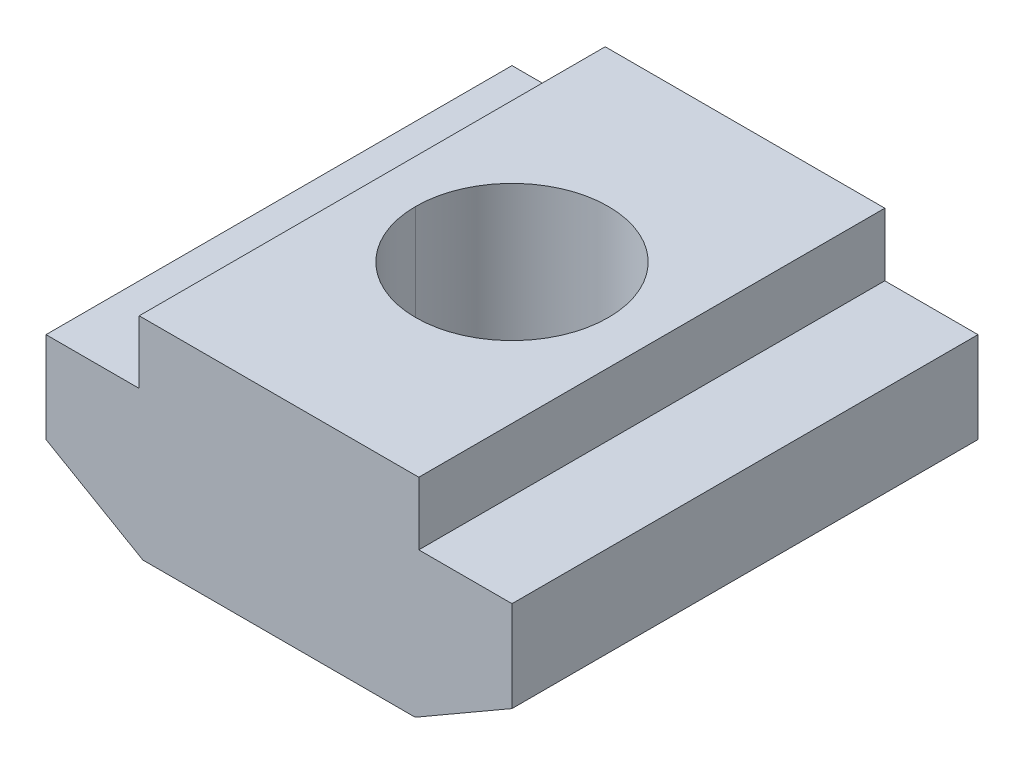
ISO-10303-21;
HEADER;
FILE_DESCRIPTION(('STEP AP214'),'2;1');
FILE_NAME('part.step','',(''),(''),'','','');
FILE_SCHEMA(('AUTOMOTIVE_DESIGN { 1 0 10303 214 1 1 1 1 }'));
ENDSEC;
DATA;
#1=APPLICATION_CONTEXT('core data for automotive mechanical design processes');
#2=APPLICATION_PROTOCOL_DEFINITION('international standard','automotive_design',2000,#1);
#3=PRODUCT_CONTEXT('',#1,'mechanical');
#4=PRODUCT('Part','Part','',(#3));
#5=PRODUCT_RELATED_PRODUCT_CATEGORY('part','',(#4));
#6=PRODUCT_DEFINITION_FORMATION('','',#4);
#7=PRODUCT_DEFINITION_CONTEXT('part definition',#1,'design');
#8=PRODUCT_DEFINITION('design','',#6,#7);
#9=PRODUCT_DEFINITION_SHAPE('','',#8);
#10=(LENGTH_UNIT() NAMED_UNIT(*) SI_UNIT(.MILLI.,.METRE.));
#11=(NAMED_UNIT(*) PLANE_ANGLE_UNIT() SI_UNIT($,.RADIAN.));
#12=(NAMED_UNIT(*) SI_UNIT($,.STERADIAN.) SOLID_ANGLE_UNIT());
#13=UNCERTAINTY_MEASURE_WITH_UNIT(LENGTH_MEASURE(1.E-05),#10,'distance_accuracy_value','');
#14=(GEOMETRIC_REPRESENTATION_CONTEXT(3) GLOBAL_UNCERTAINTY_ASSIGNED_CONTEXT((#13)) GLOBAL_UNIT_ASSIGNED_CONTEXT((#10,
#11,#12)) REPRESENTATION_CONTEXT('',''));
#15=CARTESIAN_POINT('',(0.,0.,0.));
#16=DIRECTION('',(0.,0.,1.));
#17=DIRECTION('',(1.,0.,0.));
#18=AXIS2_PLACEMENT_3D('',#15,#16,#17);
#19=CARTESIAN_POINT('',(-5.,-0.375,0.));
#20=DIRECTION('',(0.50000000000019,0.866025403784329,0.));
#21=DIRECTION('',(0.,0.,-1.));
#22=AXIS2_PLACEMENT_3D('',#19,#20,#21);
#23=PLANE('',#22);
#24=DIRECTION('',(0.,0.,1.));
#25=VECTOR('',#24,1.);
#26=CARTESIAN_POINT('',(-5.,-0.375,0.));
#27=LINE('',#26,#25);
#28=CARTESIAN_POINT('',(-5.,-0.375,-5.));
#29=VERTEX_POINT('',#28);
#30=CARTESIAN_POINT('',(-5.,-0.375,5.));
#31=VERTEX_POINT('',#30);
#32=EDGE_CURVE('E191',#29,#31,#27,.T.);
#33=ORIENTED_EDGE('',*,*,#32,.F.);
#34=DIRECTION('',(0.866025403784329,-0.50000000000019,0.));
#35=VECTOR('',#34,1.);
#36=CARTESIAN_POINT('',(-3.96076951546,-0.975,-5.));
#37=LINE('',#36,#35);
#38=CARTESIAN_POINT('',(-2.92153903092,-1.575,-5.));
#39=VERTEX_POINT('',#38);
#40=EDGE_CURVE('E200',#29,#39,#37,.T.);
#41=ORIENTED_EDGE('',*,*,#40,.T.);
#42=DIRECTION('',(0.,0.,1.));
#43=VECTOR('',#42,1.);
#44=CARTESIAN_POINT('',(-2.92153903092,-1.575,0.));
#45=LINE('',#44,#43);
#46=CARTESIAN_POINT('',(-2.92153903092,-1.575,5.));
#47=VERTEX_POINT('',#46);
#48=EDGE_CURVE('E11',#39,#47,#45,.T.);
#49=ORIENTED_EDGE('',*,*,#48,.T.);
#50=DIRECTION('',(-0.866025403784329,0.50000000000019,0.));
#51=VECTOR('',#50,1.);
#52=CARTESIAN_POINT('',(-3.96076951546,-0.975,5.));
#53=LINE('',#52,#51);
#54=EDGE_CURVE('E26',#47,#31,#53,.T.);
#55=ORIENTED_EDGE('',*,*,#54,.T.);
#56=EDGE_LOOP('',(#33,#41,#49,#55));
#57=FACE_BOUND('',#56,.T.);
#58=ADVANCED_FACE('F17',(#57),#23,.F.);
#59=CARTESIAN_POINT('',(5.,-1.575,0.));
#60=DIRECTION('',(0.,1.,0.));
#61=DIRECTION('',(1.,0.,0.));
#62=AXIS2_PLACEMENT_3D('',#59,#60,#61);
#63=PLANE('',#62);
#64=CARTESIAN_POINT('',(0.,-1.575,0.));
#65=DIRECTION('',(0.,1.,0.));
#66=DIRECTION('',(1.,0.,0.));
#67=AXIS2_PLACEMENT_3D('',#64,#65,#66);
#68=CIRCLE('',#67,2.067);
#69=CARTESIAN_POINT('',(-2.067,-1.575,0.));
#70=VERTEX_POINT('',#69);
#71=CARTESIAN_POINT('',(2.067,-1.575,0.));
#72=VERTEX_POINT('',#71);
#73=EDGE_CURVE('E230',#70,#72,#68,.T.);
#74=ORIENTED_EDGE('',*,*,#73,.T.);
#75=CARTESIAN_POINT('',(0.,-1.575,0.));
#76=DIRECTION('',(0.,1.,0.));
#77=DIRECTION('',(1.,0.,0.));
#78=AXIS2_PLACEMENT_3D('',#75,#76,#77);
#79=CIRCLE('',#78,2.067);
#80=EDGE_CURVE('E242',#72,#70,#79,.T.);
#81=ORIENTED_EDGE('',*,*,#80,.T.);
#82=EDGE_LOOP('',(#74,#81));
#83=FACE_BOUND('',#82,.T.);
#84=ORIENTED_EDGE('',*,*,#48,.F.);
#85=DIRECTION('',(1.,0.,0.));
#86=VECTOR('',#85,1.);
#87=CARTESIAN_POINT('',(0.,-1.575,-5.));
#88=LINE('',#87,#86);
#89=CARTESIAN_POINT('',(2.92153903092,-1.575,-5.));
#90=VERTEX_POINT('',#89);
#91=EDGE_CURVE('E203',#39,#90,#88,.T.);
#92=ORIENTED_EDGE('',*,*,#91,.T.);
#93=DIRECTION('',(0.,0.,1.));
#94=VECTOR('',#93,1.);
#95=CARTESIAN_POINT('',(2.92153903092,-1.575,0.));
#96=LINE('',#95,#94);
#97=CARTESIAN_POINT('',(2.92153903092,-1.575,5.));
#98=VERTEX_POINT('',#97);
#99=EDGE_CURVE('E183',#90,#98,#96,.T.);
#100=ORIENTED_EDGE('',*,*,#99,.T.);
#101=DIRECTION('',(1.,0.,0.));
#102=VECTOR('',#101,1.);
#103=CARTESIAN_POINT('',(0.,-1.575,5.));
#104=LINE('',#103,#102);
#105=EDGE_CURVE('E206',#47,#98,#104,.T.);
#106=ORIENTED_EDGE('',*,*,#105,.F.);
#107=EDGE_LOOP('',(#84,#92,#100,#106));
#108=FACE_BOUND('',#107,.T.);
#109=ADVANCED_FACE('F19',(#83,#108),#63,.F.);
#110=CARTESIAN_POINT('',(0.,0.,5.));
#111=DIRECTION('',(0.,0.,1.));
#112=DIRECTION('',(1.,0.,0.));
#113=AXIS2_PLACEMENT_3D('',#110,#111,#112);
#114=PLANE('',#113);
#115=ORIENTED_EDGE('',*,*,#105,.T.);
#116=DIRECTION('',(-0.866025403784329,-0.50000000000019,0.));
#117=VECTOR('',#116,1.);
#118=CARTESIAN_POINT('',(3.96076951546,-0.975,5.));
#119=LINE('',#118,#117);
#120=CARTESIAN_POINT('',(5.,-0.375,5.));
#121=VERTEX_POINT('',#120);
#122=EDGE_CURVE('E190',#121,#98,#119,.T.);
#123=ORIENTED_EDGE('',*,*,#122,.F.);
#124=DIRECTION('',(0.,1.,0.));
#125=VECTOR('',#124,1.);
#126=CARTESIAN_POINT('',(5.,0.6,5.));
#127=LINE('',#126,#125);
#128=CARTESIAN_POINT('',(5.,1.575,5.));
#129=VERTEX_POINT('',#128);
#130=EDGE_CURVE('E180',#121,#129,#127,.T.);
#131=ORIENTED_EDGE('',*,*,#130,.T.);
#132=DIRECTION('',(-1.,0.,0.));
#133=VECTOR('',#132,1.);
#134=CARTESIAN_POINT('',(4.,1.575,5.));
#135=LINE('',#134,#133);
#136=CARTESIAN_POINT('',(3.,1.575,5.));
#137=VERTEX_POINT('',#136);
#138=EDGE_CURVE('E266',#129,#137,#135,.T.);
#139=ORIENTED_EDGE('',*,*,#138,.T.);
#140=DIRECTION('',(0.,1.,0.));
#141=VECTOR('',#140,1.);
#142=CARTESIAN_POINT('',(3.,2.25,5.));
#143=LINE('',#142,#141);
#144=CARTESIAN_POINT('',(3.,2.925,5.));
#145=VERTEX_POINT('',#144);
#146=EDGE_CURVE('E147',#137,#145,#143,.T.);
#147=ORIENTED_EDGE('',*,*,#146,.T.);
#148=DIRECTION('',(-1.,0.,0.));
#149=VECTOR('',#148,1.);
#150=CARTESIAN_POINT('',(0.,2.925,5.));
#151=LINE('',#150,#149);
#152=CARTESIAN_POINT('',(-3.,2.925,5.));
#153=VERTEX_POINT('',#152);
#154=EDGE_CURVE('E146',#145,#153,#151,.T.);
#155=ORIENTED_EDGE('',*,*,#154,.T.);
#156=DIRECTION('',(0.,-1.,0.));
#157=VECTOR('',#156,1.);
#158=CARTESIAN_POINT('',(-3.,2.25,5.));
#159=LINE('',#158,#157);
#160=CARTESIAN_POINT('',(-3.,1.575,5.));
#161=VERTEX_POINT('',#160);
#162=EDGE_CURVE('E161',#153,#161,#159,.T.);
#163=ORIENTED_EDGE('',*,*,#162,.T.);
#164=DIRECTION('',(-1.,0.,0.));
#165=VECTOR('',#164,1.);
#166=CARTESIAN_POINT('',(-4.,1.575,5.));
#167=LINE('',#166,#165);
#168=CARTESIAN_POINT('',(-5.,1.575,5.));
#169=VERTEX_POINT('',#168);
#170=EDGE_CURVE('E215',#161,#169,#167,.T.);
#171=ORIENTED_EDGE('',*,*,#170,.T.);
#172=DIRECTION('',(0.,-1.,0.));
#173=VECTOR('',#172,1.);
#174=CARTESIAN_POINT('',(-5.,0.6,5.));
#175=LINE('',#174,#173);
#176=EDGE_CURVE('E195',#169,#31,#175,.T.);
#177=ORIENTED_EDGE('',*,*,#176,.T.);
#178=ORIENTED_EDGE('',*,*,#54,.F.);
#179=EDGE_LOOP('',(#115,#123,#131,#139,#147,#155,#163,#171,#177,#178));
#180=FACE_BOUND('',#179,.T.);
#181=ADVANCED_FACE('F213',(#180),#114,.T.);
#182=CARTESIAN_POINT('',(0.,0.,-5.));
#183=DIRECTION('',(0.,0.,1.));
#184=DIRECTION('',(1.,0.,0.));
#185=AXIS2_PLACEMENT_3D('',#182,#183,#184);
#186=PLANE('',#185);
#187=ORIENTED_EDGE('',*,*,#40,.F.);
#188=DIRECTION('',(0.,-1.,0.));
#189=VECTOR('',#188,1.);
#190=CARTESIAN_POINT('',(-5.,0.6,-5.));
#191=LINE('',#190,#189);
#192=CARTESIAN_POINT('',(-5.,1.575,-5.));
#193=VERTEX_POINT('',#192);
#194=EDGE_CURVE('E199',#193,#29,#191,.T.);
#195=ORIENTED_EDGE('',*,*,#194,.F.);
#196=DIRECTION('',(-1.,0.,0.));
#197=VECTOR('',#196,1.);
#198=CARTESIAN_POINT('',(-4.,1.575,-5.));
#199=LINE('',#198,#197);
#200=CARTESIAN_POINT('',(-3.,1.575,-5.));
#201=VERTEX_POINT('',#200);
#202=EDGE_CURVE('E248',#201,#193,#199,.T.);
#203=ORIENTED_EDGE('',*,*,#202,.F.);
#204=DIRECTION('',(0.,-1.,0.));
#205=VECTOR('',#204,1.);
#206=CARTESIAN_POINT('',(-3.,2.25,-5.));
#207=LINE('',#206,#205);
#208=CARTESIAN_POINT('',(-3.,2.925,-5.));
#209=VERTEX_POINT('',#208);
#210=EDGE_CURVE('E141',#209,#201,#207,.T.);
#211=ORIENTED_EDGE('',*,*,#210,.F.);
#212=DIRECTION('',(-1.,0.,0.));
#213=VECTOR('',#212,1.);
#214=CARTESIAN_POINT('',(0.,2.925,-5.));
#215=LINE('',#214,#213);
#216=CARTESIAN_POINT('',(3.,2.925,-5.));
#217=VERTEX_POINT('',#216);
#218=EDGE_CURVE('E133',#217,#209,#215,.T.);
#219=ORIENTED_EDGE('',*,*,#218,.F.);
#220=DIRECTION('',(0.,1.,0.));
#221=VECTOR('',#220,1.);
#222=CARTESIAN_POINT('',(3.,2.25,-5.));
#223=LINE('',#222,#221);
#224=CARTESIAN_POINT('',(3.,1.575,-5.));
#225=VERTEX_POINT('',#224);
#226=EDGE_CURVE('E138',#225,#217,#223,.T.);
#227=ORIENTED_EDGE('',*,*,#226,.F.);
#228=DIRECTION('',(-1.,0.,0.));
#229=VECTOR('',#228,1.);
#230=CARTESIAN_POINT('',(4.,1.575,-5.));
#231=LINE('',#230,#229);
#232=CARTESIAN_POINT('',(5.,1.575,-5.));
#233=VERTEX_POINT('',#232);
#234=EDGE_CURVE('E236',#233,#225,#231,.T.);
#235=ORIENTED_EDGE('',*,*,#234,.F.);
#236=DIRECTION('',(0.,1.,0.));
#237=VECTOR('',#236,1.);
#238=CARTESIAN_POINT('',(5.,0.6,-5.));
#239=LINE('',#238,#237);
#240=CARTESIAN_POINT('',(5.,-0.375,-5.));
#241=VERTEX_POINT('',#240);
#242=EDGE_CURVE('E175',#241,#233,#239,.T.);
#243=ORIENTED_EDGE('',*,*,#242,.F.);
#244=DIRECTION('',(0.866025403784329,0.50000000000019,0.));
#245=VECTOR('',#244,1.);
#246=CARTESIAN_POINT('',(3.96076951546,-0.975,-5.));
#247=LINE('',#246,#245);
#248=EDGE_CURVE('E187',#90,#241,#247,.T.);
#249=ORIENTED_EDGE('',*,*,#248,.F.);
#250=ORIENTED_EDGE('',*,*,#91,.F.);
#251=EDGE_LOOP('',(#187,#195,#203,#211,#219,#227,#235,#243,#249,#250));
#252=FACE_BOUND('',#251,.T.);
#253=ADVANCED_FACE('F135',(#252),#186,.F.);
#254=CARTESIAN_POINT('',(-5.,-1.575,0.));
#255=DIRECTION('',(1.,0.,0.));
#256=DIRECTION('',(0.,1.,0.));
#257=AXIS2_PLACEMENT_3D('',#254,#255,#256);
#258=PLANE('',#257);
#259=ORIENTED_EDGE('',*,*,#32,.T.);
#260=ORIENTED_EDGE('',*,*,#176,.F.);
#261=DIRECTION('',(0.,0.,1.));
#262=VECTOR('',#261,1.);
#263=CARTESIAN_POINT('',(-5.,1.575,0.));
#264=LINE('',#263,#262);
#265=EDGE_CURVE('E221',#193,#169,#264,.T.);
#266=ORIENTED_EDGE('',*,*,#265,.F.);
#267=ORIENTED_EDGE('',*,*,#194,.T.);
#268=EDGE_LOOP('',(#259,#260,#266,#267));
#269=FACE_BOUND('',#268,.T.);
#270=ADVANCED_FACE('F220',(#269),#258,.F.);
#271=CARTESIAN_POINT('',(5.,-0.375,0.));
#272=DIRECTION('',(-0.50000000000019,0.866025403784329,0.));
#273=DIRECTION('',(0.,0.,1.));
#274=AXIS2_PLACEMENT_3D('',#271,#272,#273);
#275=PLANE('',#274);
#276=ORIENTED_EDGE('',*,*,#99,.F.);
#277=ORIENTED_EDGE('',*,*,#248,.T.);
#278=DIRECTION('',(0.,0.,1.));
#279=VECTOR('',#278,1.);
#280=CARTESIAN_POINT('',(5.,-0.375,0.));
#281=LINE('',#280,#279);
#282=EDGE_CURVE('E171',#241,#121,#281,.T.);
#283=ORIENTED_EDGE('',*,*,#282,.T.);
#284=ORIENTED_EDGE('',*,*,#122,.T.);
#285=EDGE_LOOP('',(#276,#277,#283,#284));
#286=FACE_BOUND('',#285,.T.);
#287=ADVANCED_FACE('F310',(#286),#275,.F.);
#288=CARTESIAN_POINT('',(5.,1.575,0.));
#289=DIRECTION('',(-1.,0.,0.));
#290=DIRECTION('',(0.,0.,1.));
#291=AXIS2_PLACEMENT_3D('',#288,#289,#290);
#292=PLANE('',#291);
#293=ORIENTED_EDGE('',*,*,#282,.F.);
#294=ORIENTED_EDGE('',*,*,#242,.T.);
#295=DIRECTION('',(0.,0.,1.));
#296=VECTOR('',#295,1.);
#297=CARTESIAN_POINT('',(5.,1.575,0.));
#298=LINE('',#297,#296);
#299=EDGE_CURVE('E239',#233,#129,#298,.T.);
#300=ORIENTED_EDGE('',*,*,#299,.T.);
#301=ORIENTED_EDGE('',*,*,#130,.F.);
#302=EDGE_LOOP('',(#293,#294,#300,#301));
#303=FACE_BOUND('',#302,.T.);
#304=ADVANCED_FACE('F306',(#303),#292,.F.);
#305=CARTESIAN_POINT('',(-3.,2.925,0.));
#306=DIRECTION('',(0.,-1.,0.));
#307=DIRECTION('',(0.,0.,-1.));
#308=AXIS2_PLACEMENT_3D('',#305,#306,#307);
#309=PLANE('',#308);
#310=CARTESIAN_POINT('',(0.,2.925,0.));
#311=DIRECTION('',(0.,-1.,0.));
#312=DIRECTION('',(1.,0.,0.));
#313=AXIS2_PLACEMENT_3D('',#310,#311,#312);
#314=CIRCLE('',#313,2.067);
#315=CARTESIAN_POINT('',(2.067,2.925,0.));
#316=VERTEX_POINT('',#315);
#317=CARTESIAN_POINT('',(-2.067,2.925,0.));
#318=VERTEX_POINT('',#317);
#319=EDGE_CURVE('E270',#316,#318,#314,.T.);
#320=ORIENTED_EDGE('',*,*,#319,.T.);
#321=CARTESIAN_POINT('',(0.,2.925,0.));
#322=DIRECTION('',(0.,-1.,0.));
#323=DIRECTION('',(1.,0.,0.));
#324=AXIS2_PLACEMENT_3D('',#321,#322,#323);
#325=CIRCLE('',#324,2.067);
#326=EDGE_CURVE('E234',#318,#316,#325,.T.);
#327=ORIENTED_EDGE('',*,*,#326,.T.);
#328=EDGE_LOOP('',(#320,#327));
#329=FACE_BOUND('',#328,.T.);
#330=DIRECTION('',(0.,0.,1.));
#331=VECTOR('',#330,1.);
#332=CARTESIAN_POINT('',(3.,2.925,0.));
#333=LINE('',#332,#331);
#334=EDGE_CURVE('E150',#217,#145,#333,.T.);
#335=ORIENTED_EDGE('',*,*,#334,.F.);
#336=ORIENTED_EDGE('',*,*,#218,.T.);
#337=DIRECTION('',(0.,0.,1.));
#338=VECTOR('',#337,1.);
#339=CARTESIAN_POINT('',(-3.,2.925,0.));
#340=LINE('',#339,#338);
#341=EDGE_CURVE('E256',#209,#153,#340,.T.);
#342=ORIENTED_EDGE('',*,*,#341,.T.);
#343=ORIENTED_EDGE('',*,*,#154,.F.);
#344=EDGE_LOOP('',(#335,#336,#342,#343));
#345=FACE_BOUND('',#344,.T.);
#346=ADVANCED_FACE('F151',(#329,#345),#309,.F.);
#347=CARTESIAN_POINT('',(3.,2.925,0.));
#348=DIRECTION('',(-1.,0.,0.));
#349=DIRECTION('',(0.,0.,1.));
#350=AXIS2_PLACEMENT_3D('',#347,#348,#349);
#351=PLANE('',#350);
#352=DIRECTION('',(0.,0.,1.));
#353=VECTOR('',#352,1.);
#354=CARTESIAN_POINT('',(3.,1.575,0.));
#355=LINE('',#354,#353);
#356=EDGE_CURVE('E158',#225,#137,#355,.T.);
#357=ORIENTED_EDGE('',*,*,#356,.F.);
#358=ORIENTED_EDGE('',*,*,#226,.T.);
#359=ORIENTED_EDGE('',*,*,#334,.T.);
#360=ORIENTED_EDGE('',*,*,#146,.F.);
#361=EDGE_LOOP('',(#357,#358,#359,#360));
#362=FACE_BOUND('',#361,.T.);
#363=ADVANCED_FACE('F156',(#362),#351,.F.);
#364=CARTESIAN_POINT('',(-3.,1.575,0.));
#365=DIRECTION('',(1.,0.,0.));
#366=DIRECTION('',(0.,1.,0.));
#367=AXIS2_PLACEMENT_3D('',#364,#365,#366);
#368=PLANE('',#367);
#369=ORIENTED_EDGE('',*,*,#341,.F.);
#370=ORIENTED_EDGE('',*,*,#210,.T.);
#371=DIRECTION('',(0.,0.,1.));
#372=VECTOR('',#371,1.);
#373=CARTESIAN_POINT('',(-3.,1.575,0.));
#374=LINE('',#373,#372);
#375=EDGE_CURVE('E228',#201,#161,#374,.T.);
#376=ORIENTED_EDGE('',*,*,#375,.T.);
#377=ORIENTED_EDGE('',*,*,#162,.F.);
#378=EDGE_LOOP('',(#369,#370,#376,#377));
#379=FACE_BOUND('',#378,.T.);
#380=ADVANCED_FACE('F302',(#379),#368,.F.);
#381=CARTESIAN_POINT('',(3.,1.575,0.));
#382=DIRECTION('',(0.,-1.,0.));
#383=DIRECTION('',(0.,0.,-1.));
#384=AXIS2_PLACEMENT_3D('',#381,#382,#383);
#385=PLANE('',#384);
#386=ORIENTED_EDGE('',*,*,#375,.F.);
#387=ORIENTED_EDGE('',*,*,#202,.T.);
#388=ORIENTED_EDGE('',*,*,#265,.T.);
#389=ORIENTED_EDGE('',*,*,#170,.F.);
#390=EDGE_LOOP('',(#386,#387,#388,#389));
#391=FACE_BOUND('',#390,.T.);
#392=ADVANCED_FACE('F360',(#391),#385,.F.);
#393=CARTESIAN_POINT('',(3.,1.575,0.));
#394=DIRECTION('',(0.,-1.,0.));
#395=DIRECTION('',(0.,0.,-1.));
#396=AXIS2_PLACEMENT_3D('',#393,#394,#395);
#397=PLANE('',#396);
#398=ORIENTED_EDGE('',*,*,#299,.F.);
#399=ORIENTED_EDGE('',*,*,#234,.T.);
#400=ORIENTED_EDGE('',*,*,#356,.T.);
#401=ORIENTED_EDGE('',*,*,#138,.F.);
#402=EDGE_LOOP('',(#398,#399,#400,#401));
#403=FACE_BOUND('',#402,.T.);
#404=ADVANCED_FACE('F368',(#403),#397,.F.);
#405=CARTESIAN_POINT('',(0.,-1.575,0.));
#406=DIRECTION('',(0.,1.,0.));
#407=DIRECTION('',(1.,0.,0.));
#408=AXIS2_PLACEMENT_3D('',#405,#406,#407);
#409=CYLINDRICAL_SURFACE('',#408,2.067);
#410=DIRECTION('',(0.,-1.,0.));
#411=VECTOR('',#410,1.);
#412=CARTESIAN_POINT('',(2.067,3.26999999998,0.));
#413=LINE('',#412,#411);
#414=EDGE_CURVE('E235',#316,#72,#413,.T.);
#415=ORIENTED_EDGE('',*,*,#414,.F.);
#416=ORIENTED_EDGE('',*,*,#326,.F.);
#417=DIRECTION('',(0.,-1.,0.));
#418=VECTOR('',#417,1.);
#419=CARTESIAN_POINT('',(-2.067,3.26999999998,0.));
#420=LINE('',#419,#418);
#421=EDGE_CURVE('E265',#318,#70,#420,.T.);
#422=ORIENTED_EDGE('',*,*,#421,.T.);
#423=ORIENTED_EDGE('',*,*,#80,.F.);
#424=EDGE_LOOP('',(#415,#416,#422,#423));
#425=FACE_BOUND('',#424,.T.);
#426=ADVANCED_FACE('F286',(#425),#409,.F.);
#427=CARTESIAN_POINT('',(0.,-1.575,0.));
#428=DIRECTION('',(0.,1.,0.));
#429=DIRECTION('',(1.,0.,0.));
#430=AXIS2_PLACEMENT_3D('',#427,#428,#429);
#431=CYLINDRICAL_SURFACE('',#430,2.067);
#432=ORIENTED_EDGE('',*,*,#421,.F.);
#433=ORIENTED_EDGE('',*,*,#319,.F.);
#434=ORIENTED_EDGE('',*,*,#414,.T.);
#435=ORIENTED_EDGE('',*,*,#73,.F.);
#436=EDGE_LOOP('',(#432,#433,#434,#435));
#437=FACE_BOUND('',#436,.T.);
#438=ADVANCED_FACE('F283',(#437),#431,.F.);
#439=CLOSED_SHELL('',(#58,#109,#181,#253,#270,#287,#304,#346,#363,#380,#392,#404,#426,#438));
#440=MANIFOLD_SOLID_BREP('B1',#439);
#441=ADVANCED_BREP_SHAPE_REPRESENTATION('',(#18,#440),#14);
#442=SHAPE_DEFINITION_REPRESENTATION(#9,#441);
ENDSEC;
END-ISO-10303-21;
